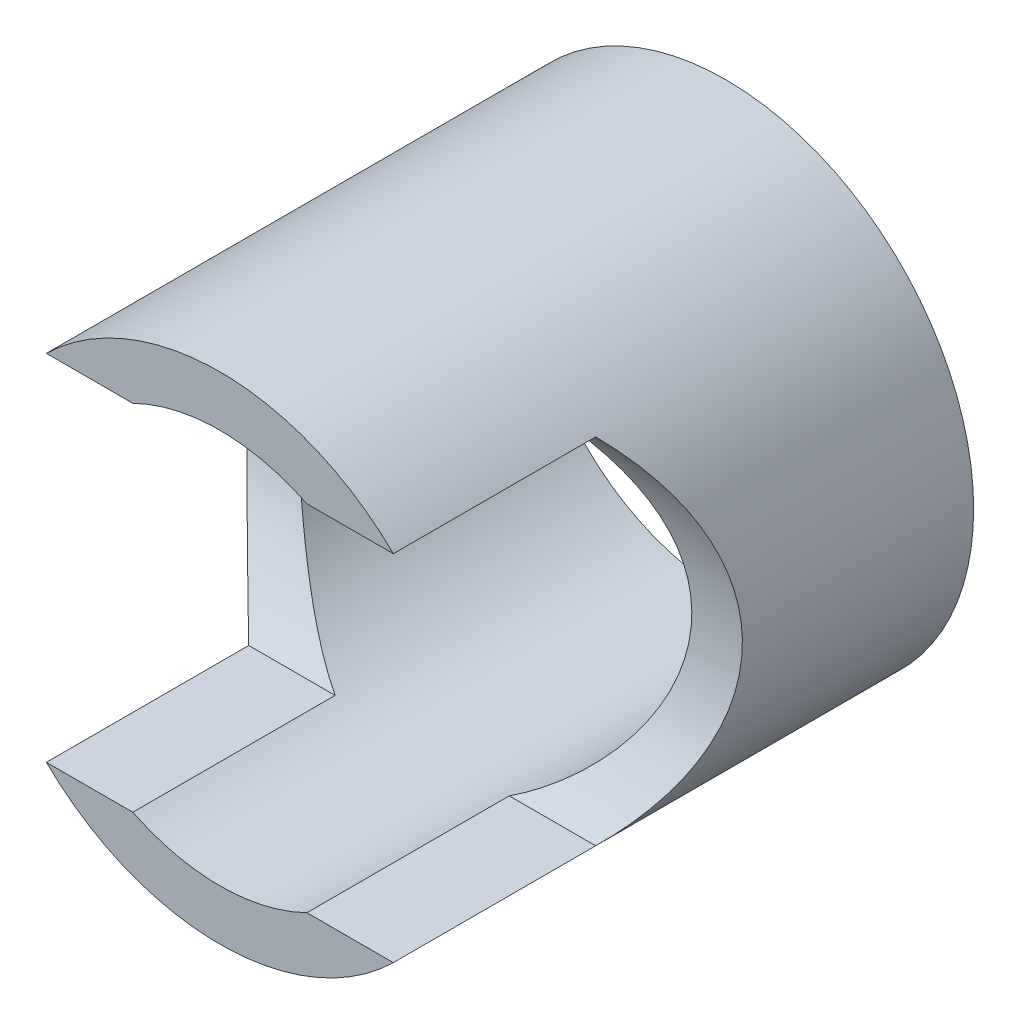
ISO-10303-21;
HEADER;
FILE_DESCRIPTION(('STEP AP214'),'2;1');
FILE_NAME('part.step','',(''),(''),'','','');
FILE_SCHEMA(('AUTOMOTIVE_DESIGN { 1 0 10303 214 1 1 1 1 }'));
ENDSEC;
DATA;
#1=APPLICATION_CONTEXT('core data for automotive mechanical design processes');
#2=APPLICATION_PROTOCOL_DEFINITION('international standard','automotive_design',2000,#1);
#3=PRODUCT_CONTEXT('',#1,'mechanical');
#4=PRODUCT('Part','Part','',(#3));
#5=PRODUCT_RELATED_PRODUCT_CATEGORY('part','',(#4));
#6=PRODUCT_DEFINITION_FORMATION('','',#4);
#7=PRODUCT_DEFINITION_CONTEXT('part definition',#1,'design');
#8=PRODUCT_DEFINITION('design','',#6,#7);
#9=PRODUCT_DEFINITION_SHAPE('','',#8);
#10=(LENGTH_UNIT() NAMED_UNIT(*) SI_UNIT(.MILLI.,.METRE.));
#11=(NAMED_UNIT(*) PLANE_ANGLE_UNIT() SI_UNIT($,.RADIAN.));
#12=(NAMED_UNIT(*) SI_UNIT($,.STERADIAN.) SOLID_ANGLE_UNIT());
#13=UNCERTAINTY_MEASURE_WITH_UNIT(LENGTH_MEASURE(1.E-05),#10,'distance_accuracy_value','');
#14=(GEOMETRIC_REPRESENTATION_CONTEXT(3) GLOBAL_UNCERTAINTY_ASSIGNED_CONTEXT((#13)) GLOBAL_UNIT_ASSIGNED_CONTEXT((#10,
#11,#12)) REPRESENTATION_CONTEXT('',''));
#15=CARTESIAN_POINT('',(0.,0.,0.));
#16=DIRECTION('',(0.,0.,1.));
#17=DIRECTION('',(1.,0.,0.));
#18=AXIS2_PLACEMENT_3D('',#15,#16,#17);
#19=CARTESIAN_POINT('',(0.,0.,10.));
#20=DIRECTION('',(0.,0.,1.));
#21=DIRECTION('',(1.,0.,0.));
#22=AXIS2_PLACEMENT_3D('',#19,#20,#21);
#23=PLANE('',#22);
#24=DIRECTION('',(1.,0.,0.));
#25=VECTOR('',#24,1.);
#26=CARTESIAN_POINT('',(-5.1,3.5,10.));
#27=LINE('',#26,#25);
#28=CARTESIAN_POINT('',(1.72046505340852,3.5,10.));
#29=VERTEX_POINT('',#28);
#30=CARTESIAN_POINT('',(3.42928563989645,3.5,10.));
#31=VERTEX_POINT('',#30);
#32=EDGE_CURVE('E124',#29,#31,#27,.T.);
#33=ORIENTED_EDGE('',*,*,#32,.T.);
#34=CARTESIAN_POINT('',(0.,0.,10.));
#35=DIRECTION('',(0.,0.,1.));
#36=DIRECTION('',(1.,0.,0.));
#37=AXIS2_PLACEMENT_3D('',#34,#35,#36);
#38=CIRCLE('',#37,4.9);
#39=CARTESIAN_POINT('',(-3.42928563989645,3.5,10.));
#40=VERTEX_POINT('',#39);
#41=EDGE_CURVE('E131',#31,#40,#38,.T.);
#42=ORIENTED_EDGE('',*,*,#41,.T.);
#43=CARTESIAN_POINT('',(-1.72046505340852,3.5,10.));
#44=VERTEX_POINT('',#43);
#45=EDGE_CURVE('E111',#40,#44,#27,.T.);
#46=ORIENTED_EDGE('',*,*,#45,.T.);
#47=CARTESIAN_POINT('',(0.,0.,10.));
#48=DIRECTION('',(0.,0.,1.));
#49=DIRECTION('',(1.,0.,0.));
#50=AXIS2_PLACEMENT_3D('',#47,#48,#49);
#51=CIRCLE('',#50,3.9);
#52=EDGE_CURVE('E155',#29,#44,#51,.T.);
#53=ORIENTED_EDGE('',*,*,#52,.F.);
#54=EDGE_LOOP('',(#33,#42,#46,#53));
#55=FACE_BOUND('',#54,.T.);
#56=ADVANCED_FACE('F45',(#55),#23,.T.);
#57=DIRECTION('',(1.,0.,0.));
#58=VECTOR('',#57,1.);
#59=CARTESIAN_POINT('',(-5.1,-3.5,10.));
#60=LINE('',#59,#58);
#61=CARTESIAN_POINT('',(-3.42928563989645,-3.5,10.));
#62=VERTEX_POINT('',#61);
#63=CARTESIAN_POINT('',(-1.72046505340852,-3.5,10.));
#64=VERTEX_POINT('',#63);
#65=EDGE_CURVE('E70',#62,#64,#60,.T.);
#66=ORIENTED_EDGE('',*,*,#65,.F.);
#67=CARTESIAN_POINT('',(3.42928563989645,-3.5,10.));
#68=VERTEX_POINT('',#67);
#69=EDGE_CURVE('E141',#62,#68,#38,.T.);
#70=ORIENTED_EDGE('',*,*,#69,.T.);
#71=CARTESIAN_POINT('',(1.72046505340852,-3.5,10.));
#72=VERTEX_POINT('',#71);
#73=EDGE_CURVE('E123',#72,#68,#60,.T.);
#74=ORIENTED_EDGE('',*,*,#73,.F.);
#75=EDGE_CURVE('E205',#64,#72,#51,.T.);
#76=ORIENTED_EDGE('',*,*,#75,.F.);
#77=EDGE_LOOP('',(#66,#70,#74,#76));
#78=FACE_BOUND('',#77,.T.);
#79=ADVANCED_FACE('F224',(#78),#23,.T.);
#80=CARTESIAN_POINT('',(0.,0.,0.));
#81=DIRECTION('',(0.,0.,1.));
#82=DIRECTION('',(1.,0.,0.));
#83=AXIS2_PLACEMENT_3D('',#80,#81,#82);
#84=PLANE('',#83);
#85=CARTESIAN_POINT('',(0.,0.,0.));
#86=DIRECTION('',(0.,0.,1.));
#87=DIRECTION('',(1.,0.,0.));
#88=AXIS2_PLACEMENT_3D('',#85,#86,#87);
#89=CIRCLE('',#88,4.9);
#90=CARTESIAN_POINT('',(4.9,0.,0.));
#91=VERTEX_POINT('',#90);
#92=EDGE_CURVE('E148',#91,#91,#89,.T.);
#93=ORIENTED_EDGE('',*,*,#92,.F.);
#94=EDGE_LOOP('',(#93));
#95=FACE_BOUND('',#94,.T.);
#96=CARTESIAN_POINT('',(0.,0.,0.));
#97=DIRECTION('',(0.,0.,1.));
#98=DIRECTION('',(1.,0.,0.));
#99=AXIS2_PLACEMENT_3D('',#96,#97,#98);
#100=CIRCLE('',#99,3.9);
#101=CARTESIAN_POINT('',(3.9,0.,0.));
#102=VERTEX_POINT('',#101);
#103=EDGE_CURVE('E151',#102,#102,#100,.T.);
#104=ORIENTED_EDGE('',*,*,#103,.T.);
#105=EDGE_LOOP('',(#104));
#106=FACE_BOUND('',#105,.T.);
#107=ADVANCED_FACE('F216',(#95,#106),#84,.F.);
#108=CARTESIAN_POINT('',(0.,0.,10.));
#109=DIRECTION('',(0.,0.,-1.));
#110=DIRECTION('',(-1.,0.,0.));
#111=AXIS2_PLACEMENT_3D('',#108,#109,#110);
#112=CYLINDRICAL_SURFACE('',#111,4.9);
#113=ORIENTED_EDGE('',*,*,#41,.F.);
#114=DIRECTION('',(0.,0.,-1.));
#115=VECTOR('',#114,1.);
#116=CARTESIAN_POINT('',(3.42928563989645,3.5,10.));
#117=LINE('',#116,#115);
#118=CARTESIAN_POINT('',(3.42928563989645,3.5,6.));
#119=VERTEX_POINT('',#118);
#120=EDGE_CURVE('E135',#31,#119,#117,.T.);
#121=ORIENTED_EDGE('',*,*,#120,.T.);
#122=CARTESIAN_POINT('',(3.42928563989645,3.5,6.));
#123=CARTESIAN_POINT('',(3.59647088448412,3.33615304909569,5.8393997068793));
#124=CARTESIAN_POINT('',(3.75570601331172,3.15668633621734,5.68561143874868));
#125=CARTESIAN_POINT('',(3.97859837261846,2.86288178823428,5.46963073103491));
#126=CARTESIAN_POINT('',(4.05055827961444,2.76026411110945,5.39977230884082));
#127=CARTESIAN_POINT('',(4.18793279886013,2.54702000985872,5.26623664662138));
#128=CARTESIAN_POINT('',(4.25335051737735,2.43639742992314,5.20255647356196));
#129=CARTESIAN_POINT('',(4.41347640695718,2.13875774468054,5.0465260072286));
#130=CARTESIAN_POINT('',(4.50240134290289,1.9455077445347,4.959711376047));
#131=CARTESIAN_POINT('',(4.61768038886163,1.64277148473097,4.84706013541428));
#132=CARTESIAN_POINT('',(4.65306059412761,1.53983232805395,4.81246570474566));
#133=CARTESIAN_POINT('',(4.71730046472611,1.33006900258503,4.74962734112169));
#134=CARTESIAN_POINT('',(4.74616322060221,1.22324670317915,4.72138039824865));
#135=CARTESIAN_POINT('',(4.79707588203657,1.00533773767093,4.67153980750522));
#136=CARTESIAN_POINT('',(4.81905831941332,0.894220157962149,4.65001205317787));
#137=CARTESIAN_POINT('',(4.8553641570014,0.669605201515297,4.61445073544212));
#138=CARTESIAN_POINT('',(4.86969129584225,0.556109014617853,4.60041351387552));
#139=CARTESIAN_POINT('',(4.8903793876584,0.327644498313018,4.58014247556506));
#140=CARTESIAN_POINT('',(4.89673671510595,0.21267552292952,4.57391221026551));
#141=CARTESIAN_POINT('',(4.90132097544629,-0.0175717222468311,4.56941967406483));
#142=CARTESIAN_POINT('',(4.89954883818889,-0.132849955159364,4.57115649188712));
#143=CARTESIAN_POINT('',(4.88866158728509,-0.34793253457521,4.58182544597551));
#144=CARTESIAN_POINT('',(4.8805121114451,-0.447834737506318,4.58981135704402));
#145=CARTESIAN_POINT('',(4.85821509354931,-0.646328156210551,4.61165693207009));
#146=CARTESIAN_POINT('',(4.84406570057012,-0.744918957739484,4.6255184085891));
#147=CARTESIAN_POINT('',(4.79297179723202,-1.03754229383496,4.67556052455862));
#148=CARTESIAN_POINT('',(4.74736529930223,-1.22872784316862,4.72021481873029));
#149=CARTESIAN_POINT('',(4.63463085723501,-1.60290962229225,4.83049665130938));
#150=CARTESIAN_POINT('',(4.5670571037257,-1.78563788896439,4.89655854449543));
#151=CARTESIAN_POINT('',(4.41396697748892,-2.13625025584745,5.04602247959144));
#152=CARTESIAN_POINT('',(4.32841099008432,-2.30410039931065,5.12946280225858));
#153=CARTESIAN_POINT('',(4.11993016437683,-2.66255110551661,5.33242474310469));
#154=CARTESIAN_POINT('',(3.99298904175377,-2.84860403448254,5.45577399385353));
#155=CARTESIAN_POINT('',(3.72243714970002,-3.19392868767649,5.71773122137827));
#156=CARTESIAN_POINT('',(3.57893243159212,-3.35335637376824,5.85624185859243));
#157=CARTESIAN_POINT('',(3.42928563989645,-3.5,6.));
#158=B_SPLINE_CURVE_WITH_KNOTS('',3,(#122,#123,#124,#125,#126,#127,#128,#129,#130,#131,#132,
#133,#134,#135,#136,#137,#138,#139,#140,#141,#142,#143,#144,#145,#146,#147,#148,#149,#150,#151,
#152,#153,#154,#155,#156,#157),.UNSPECIFIED.,.F.,.F.,(4,2,2,2,2,2,2,2,2,2,2,2,2,2,2,2,2,4),(0.,
0.851361120835262,1.28141106536544,1.71125584055542,2.39731391936444,2.73961448479553,
3.08175239045461,3.42714717030543,3.77237311466133,4.11775604800227,4.46309947735892,
4.76438503711408,5.06576360859585,5.66762331685644,6.2825516852289,6.89884920621709,
7.66661798584835,8.4297184229883),.UNSPECIFIED.);
#159=CARTESIAN_POINT('',(3.42928563989645,-3.5,6.));
#160=VERTEX_POINT('',#159);
#161=EDGE_CURVE('E136',#119,#160,#158,.T.);
#162=ORIENTED_EDGE('',*,*,#161,.T.);
#163=DIRECTION('',(0.,0.,-1.));
#164=VECTOR('',#163,1.);
#165=CARTESIAN_POINT('',(3.42928563989645,-3.5,10.));
#166=LINE('',#165,#164);
#167=EDGE_CURVE('E322',#160,#68,#166,.F.);
#168=ORIENTED_EDGE('',*,*,#167,.T.);
#169=ORIENTED_EDGE('',*,*,#69,.F.);
#170=DIRECTION('',(0.,0.,-1.));
#171=VECTOR('',#170,1.);
#172=CARTESIAN_POINT('',(-3.42928563989645,-3.5,10.));
#173=LINE('',#172,#171);
#174=CARTESIAN_POINT('',(-3.42928563989645,-3.5,6.));
#175=VERTEX_POINT('',#174);
#176=EDGE_CURVE('E195',#62,#175,#173,.T.);
#177=ORIENTED_EDGE('',*,*,#176,.T.);
#178=CARTESIAN_POINT('',(-3.42928563989645,-3.5,6.));
#179=CARTESIAN_POINT('',(-3.59647088448412,-3.33615304909569,5.8393997068793));
#180=CARTESIAN_POINT('',(-3.75570601331172,-3.15668633621734,5.68561143874868));
#181=CARTESIAN_POINT('',(-3.97859837261846,-2.86288178823428,5.46963073103491));
#182=CARTESIAN_POINT('',(-4.05055827961444,-2.76026411110945,5.39977230884082));
#183=CARTESIAN_POINT('',(-4.18793279886013,-2.54702000985872,5.26623664662138));
#184=CARTESIAN_POINT('',(-4.25335051737735,-2.43639742992314,5.20255647356196));
#185=CARTESIAN_POINT('',(-4.41347640695718,-2.13875774468054,5.0465260072286));
#186=CARTESIAN_POINT('',(-4.50240134290289,-1.9455077445347,4.959711376047));
#187=CARTESIAN_POINT('',(-4.61768038886163,-1.64277148473097,4.84706013541428));
#188=CARTESIAN_POINT('',(-4.65306059412761,-1.53983232805395,4.81246570474566));
#189=CARTESIAN_POINT('',(-4.71730046472611,-1.33006900258503,4.74962734112169));
#190=CARTESIAN_POINT('',(-4.74616322060221,-1.22324670317915,4.72138039824865));
#191=CARTESIAN_POINT('',(-4.79707588203657,-1.00533773767093,4.67153980750522));
#192=CARTESIAN_POINT('',(-4.81905831941332,-0.894220157962148,4.65001205317787));
#193=CARTESIAN_POINT('',(-4.8553641570014,-0.669605201515295,4.61445073544212));
#194=CARTESIAN_POINT('',(-4.86969129584225,-0.556109014617852,4.60041351387552));
#195=CARTESIAN_POINT('',(-4.8903793876584,-0.327644498313016,4.58014247556506));
#196=CARTESIAN_POINT('',(-4.89673671510595,-0.212675522929518,4.57391221026551));
#197=CARTESIAN_POINT('',(-4.90132097544629,0.0175717222468332,4.56941967406483));
#198=CARTESIAN_POINT('',(-4.89954883818889,0.132849955159367,4.57115649188712));
#199=CARTESIAN_POINT('',(-4.88866158728509,0.347932534575213,4.58182544597551));
#200=CARTESIAN_POINT('',(-4.8805121114451,0.447834737506321,4.58981135704402));
#201=CARTESIAN_POINT('',(-4.85821509354931,0.646328156210554,4.61165693207009));
#202=CARTESIAN_POINT('',(-4.84406570057012,0.744918957739487,4.6255184085891));
#203=CARTESIAN_POINT('',(-4.79297179723202,1.03754229383497,4.67556052455862));
#204=CARTESIAN_POINT('',(-4.74736529930223,1.22872784316863,4.72021481873029));
#205=CARTESIAN_POINT('',(-4.63463085723501,1.60290962229225,4.83049665130938));
#206=CARTESIAN_POINT('',(-4.5670571037257,1.78563788896439,4.89655854449543));
#207=CARTESIAN_POINT('',(-4.41396697748892,2.13625025584745,5.04602247959144));
#208=CARTESIAN_POINT('',(-4.32841099008432,2.30410039931065,5.12946280225858));
#209=CARTESIAN_POINT('',(-4.11993016437683,2.66255110551661,5.33242474310469));
#210=CARTESIAN_POINT('',(-3.99298904175377,2.84860403448255,5.45577399385353));
#211=CARTESIAN_POINT('',(-3.72243714970002,3.19392868767649,5.71773122137827));
#212=CARTESIAN_POINT('',(-3.57893243159212,3.35335637376824,5.85624185859243));
#213=CARTESIAN_POINT('',(-3.42928563989645,3.5,6.));
#214=B_SPLINE_CURVE_WITH_KNOTS('',3,(#178,#179,#180,#181,#182,#183,#184,#185,#186,#187,#188,
#189,#190,#191,#192,#193,#194,#195,#196,#197,#198,#199,#200,#201,#202,#203,#204,#205,#206,#207,
#208,#209,#210,#211,#212,#213),.UNSPECIFIED.,.F.,.F.,(4,2,2,2,2,2,2,2,2,2,2,2,2,2,2,2,2,4),(0.,
0.851361120835261,1.28141106536544,1.71125584055542,2.39731391936443,2.73961448479553,
3.08175239045461,3.42714717030543,3.77237311466134,4.11775604800227,4.46309947735892,
4.76438503711408,5.06576360859585,5.66762331685644,6.28255168522891,6.89884920621709,
7.66661798584835,8.4297184229883),.UNSPECIFIED.);
#215=CARTESIAN_POINT('',(-3.42928563989645,3.5,6.));
#216=VERTEX_POINT('',#215);
#217=EDGE_CURVE('E133',#175,#216,#214,.T.);
#218=ORIENTED_EDGE('',*,*,#217,.T.);
#219=DIRECTION('',(0.,0.,-1.));
#220=VECTOR('',#219,1.);
#221=CARTESIAN_POINT('',(-3.42928563989645,3.5,10.));
#222=LINE('',#221,#220);
#223=EDGE_CURVE('E115',#216,#40,#222,.F.);
#224=ORIENTED_EDGE('',*,*,#223,.T.);
#225=EDGE_LOOP('',(#113,#121,#162,#168,#169,#177,#218,#224));
#226=FACE_BOUND('',#225,.T.);
#227=ORIENTED_EDGE('',*,*,#92,.T.);
#228=EDGE_LOOP('',(#227));
#229=FACE_BOUND('',#228,.T.);
#230=ADVANCED_FACE('F47',(#226,#229),#112,.T.);
#231=CARTESIAN_POINT('',(0.,0.,10.));
#232=DIRECTION('',(0.,0.,-1.));
#233=DIRECTION('',(-1.,0.,0.));
#234=AXIS2_PLACEMENT_3D('',#231,#232,#233);
#235=CYLINDRICAL_SURFACE('',#234,3.9);
#236=DIRECTION('',(0.,0.,-1.));
#237=VECTOR('',#236,1.);
#238=CARTESIAN_POINT('',(-1.72046505340852,3.5,10.));
#239=LINE('',#238,#237);
#240=CARTESIAN_POINT('',(-1.72046505340852,3.5,6.));
#241=VERTEX_POINT('',#240);
#242=EDGE_CURVE('E11',#241,#44,#239,.F.);
#243=ORIENTED_EDGE('',*,*,#242,.F.);
#244=CARTESIAN_POINT('',(-1.72046505340852,-3.5,6.));
#245=CARTESIAN_POINT('',(-1.82779019322518,-3.44720081307893,5.94821291357888));
#246=CARTESIAN_POINT('',(-1.93188173605775,-3.3899433856009,5.89441702569065));
#247=CARTESIAN_POINT('',(-2.13356582335354,-3.26679276123773,5.78458124351546));
#248=CARTESIAN_POINT('',(-2.23115891055668,-3.2009002869047,5.72854153725595));
#249=CARTESIAN_POINT('',(-2.42083231343526,-3.06000849046121,5.61538583618446));
#250=CARTESIAN_POINT('',(-2.51284321972977,-2.98492003085673,5.55826472945975));
#251=CARTESIAN_POINT('',(-2.68998587949694,-2.82632504857971,5.44501706391567));
#252=CARTESIAN_POINT('',(-2.77511732826286,-2.74281815340339,5.3888905492349));
#253=CARTESIAN_POINT('',(-2.93822049550034,-2.56733918339953,5.27891828083074));
#254=CARTESIAN_POINT('',(-3.01617898753012,-2.47535207282003,5.22507683531273));
#255=CARTESIAN_POINT('',(-3.1641321562885,-2.28319331057521,5.12111164003395));
#256=CARTESIAN_POINT('',(-3.23412630133564,-2.18302111325843,5.07098813855221));
#257=CARTESIAN_POINT('',(-3.36501467501043,-1.97526444639742,4.97601003996784));
#258=CARTESIAN_POINT('',(-3.42594958293889,-1.8677164895813,4.93113209552904));
#259=CARTESIAN_POINT('',(-3.53809703219129,-1.64540957349172,4.84771414357021));
#260=CARTESIAN_POINT('',(-3.58931442874262,-1.53065425363457,4.80917097225803));
#261=CARTESIAN_POINT('',(-3.69872281218233,-1.24906927094964,4.72625177707498));
#262=CARTESIAN_POINT('',(-3.75198594509472,-1.07922407683781,4.68535858282045));
#263=CARTESIAN_POINT('',(-3.83512150816439,-0.730693188799382,4.62122365854441));
#264=CARTESIAN_POINT('',(-3.86500250858518,-0.552010759544098,4.59797546118829));
#265=CARTESIAN_POINT('',(-3.89960871945331,-0.190156755574682,4.57103162156407));
#266=CARTESIAN_POINT('',(-3.90425706612272,-0.00697316985990659,4.56739572254398));
#267=CARTESIAN_POINT('',(-3.88786160933613,0.357524948666466,4.58017892216107));
#268=CARTESIAN_POINT('',(-3.86681576088007,0.538839331549972,4.59659961710189));
#269=CARTESIAN_POINT('',(-3.80197117586339,0.885861771143153,4.64683449798546));
#270=CARTESIAN_POINT('',(-3.75927361029908,1.05190359254279,4.67980617627754));
#271=CARTESIAN_POINT('',(-3.65397298086094,1.37374580223862,4.76027054118607));
#272=CARTESIAN_POINT('',(-3.59136747681555,1.52954493223305,4.80776500787378));
#273=CARTESIAN_POINT('',(-3.44167657958895,1.84337109909312,4.91964808013358));
#274=CARTESIAN_POINT('',(-3.35278389297648,2.00009790029232,4.98524208837012));
#275=CARTESIAN_POINT('',(-3.15687578778482,2.29691629154981,5.12647598177189));
#276=CARTESIAN_POINT('',(-3.04983810288807,2.43698707875346,5.20212818477034));
#277=CARTESIAN_POINT('',(-2.7965694758015,2.72642252948765,5.3754128717374));
#278=CARTESIAN_POINT('',(-2.64679574332748,2.87187386003092,5.47438467780455));
#279=CARTESIAN_POINT('',(-2.32679369820063,3.13673730359606,5.67350935114836));
#280=CARTESIAN_POINT('',(-2.15659664926713,3.25618844803311,5.77366020682221));
#281=CARTESIAN_POINT('',(-1.93491157874474,3.38650820902509,5.89203641586831));
#282=CARTESIAN_POINT('',(-1.89275654497333,3.41025257125084,5.91405111549223));
#283=CARTESIAN_POINT('',(-1.80740644229617,3.45624536223335,5.957493808899));
#284=CARTESIAN_POINT('',(-1.76421242211502,3.47849521999768,5.97892235118288));
#285=CARTESIAN_POINT('',(-1.72046505340852,3.5,6.));
#286=B_SPLINE_CURVE_WITH_KNOTS('',3,(#244,#245,#246,#247,#248,#249,#250,#251,#252,#253,#254,
#255,#256,#257,#258,#259,#260,#261,#262,#263,#264,#265,#266,#267,#268,#269,#270,#271,#272,#273,
#274,#275,#276,#277,#278,#279,#280,#281,#282,#283,#284,#285),.UNSPECIFIED.,.F.,.F.,(4,2,2,2,2,2,
2,2,2,2,2,2,2,2,2,2,2,2,2,2,4),(0.,0.390804058848245,0.781575437362796,1.1764894276682,
1.57142090003113,1.96706658652467,2.36273866993574,2.75657658437902,3.15021720166252,
3.69566368382083,4.24091014946862,4.78781661817378,5.3347666179827,5.85633534575382,
6.37796802831749,6.95112941609271,7.52499930887871,8.2156997053583,8.90535596139311,
9.06479996945604,9.22408928458897),.UNSPECIFIED.);
#287=CARTESIAN_POINT('',(-1.72046505340852,-3.5,6.));
#288=VERTEX_POINT('',#287);
#289=EDGE_CURVE('E55',#288,#241,#286,.T.);
#290=ORIENTED_EDGE('',*,*,#289,.F.);
#291=DIRECTION('',(0.,0.,-1.));
#292=VECTOR('',#291,1.);
#293=CARTESIAN_POINT('',(-1.72046505340852,-3.5,10.));
#294=LINE('',#293,#292);
#295=EDGE_CURVE('E305',#64,#288,#294,.T.);
#296=ORIENTED_EDGE('',*,*,#295,.F.);
#297=ORIENTED_EDGE('',*,*,#75,.T.);
#298=DIRECTION('',(0.,0.,-1.));
#299=VECTOR('',#298,1.);
#300=CARTESIAN_POINT('',(1.72046505340852,-3.5,10.));
#301=LINE('',#300,#299);
#302=CARTESIAN_POINT('',(1.72046505340852,-3.5,6.));
#303=VERTEX_POINT('',#302);
#304=EDGE_CURVE('E140',#303,#72,#301,.F.);
#305=ORIENTED_EDGE('',*,*,#304,.F.);
#306=CARTESIAN_POINT('',(1.72046505340852,3.5,6.));
#307=CARTESIAN_POINT('',(1.82779019322518,3.44720081307893,5.94821291357888));
#308=CARTESIAN_POINT('',(1.93188173605775,3.3899433856009,5.89441702569065));
#309=CARTESIAN_POINT('',(2.13356582335353,3.26679276123773,5.78458124351546));
#310=CARTESIAN_POINT('',(2.23115891055668,3.2009002869047,5.72854153725595));
#311=CARTESIAN_POINT('',(2.42083231343526,3.06000849046121,5.61538583618446));
#312=CARTESIAN_POINT('',(2.51284321972977,2.98492003085673,5.55826472945975));
#313=CARTESIAN_POINT('',(2.68998587949694,2.82632504857971,5.44501706391567));
#314=CARTESIAN_POINT('',(2.77511732826286,2.7428181534034,5.3888905492349));
#315=CARTESIAN_POINT('',(2.93822049550034,2.56733918339953,5.27891828083074));
#316=CARTESIAN_POINT('',(3.01617898753012,2.47535207282003,5.22507683531273));
#317=CARTESIAN_POINT('',(3.1641321562885,2.28319331057521,5.12111164003394));
#318=CARTESIAN_POINT('',(3.23412630133564,2.18302111325843,5.07098813855221));
#319=CARTESIAN_POINT('',(3.36501467501043,1.97526444639742,4.97601003996784));
#320=CARTESIAN_POINT('',(3.42594958293889,1.86771648958131,4.93113209552904));
#321=CARTESIAN_POINT('',(3.53809703219129,1.64540957349172,4.84771414357021));
#322=CARTESIAN_POINT('',(3.58931442874262,1.53065425363457,4.80917097225803));
#323=CARTESIAN_POINT('',(3.69872281218233,1.24906927094964,4.72625177707498));
#324=CARTESIAN_POINT('',(3.75198594509472,1.07922407683781,4.68535858282045));
#325=CARTESIAN_POINT('',(3.83512150816439,0.730693188799382,4.62122365854441));
#326=CARTESIAN_POINT('',(3.86500250858518,0.552010759544099,4.59797546118829));
#327=CARTESIAN_POINT('',(3.89960871945331,0.190156755574683,4.57103162156407));
#328=CARTESIAN_POINT('',(3.90425706612272,0.00697316985990703,4.56739572254398));
#329=CARTESIAN_POINT('',(3.88786160933613,-0.357524948666465,4.58017892216107));
#330=CARTESIAN_POINT('',(3.86681576088007,-0.538839331549972,4.59659961710189));
#331=CARTESIAN_POINT('',(3.80197117586339,-0.885861771143153,4.64683449798546));
#332=CARTESIAN_POINT('',(3.75927361029908,-1.05190359254279,4.67980617627754));
#333=CARTESIAN_POINT('',(3.65397298086094,-1.37374580223862,4.76027054118607));
#334=CARTESIAN_POINT('',(3.59136747681555,-1.52954493223305,4.80776500787378));
#335=CARTESIAN_POINT('',(3.44167657958895,-1.84337109909312,4.91964808013359));
#336=CARTESIAN_POINT('',(3.35278389297647,-2.00009790029232,4.98524208837013));
#337=CARTESIAN_POINT('',(3.15687578778482,-2.29691629154981,5.12647598177189));
#338=CARTESIAN_POINT('',(3.04983810288807,-2.43698707875346,5.20212818477034));
#339=CARTESIAN_POINT('',(2.79656947580151,-2.72642252948765,5.3754128717374));
#340=CARTESIAN_POINT('',(2.64679574332748,-2.87187386003092,5.47438467780455));
#341=CARTESIAN_POINT('',(2.32679369820063,-3.13673730359606,5.67350935114836));
#342=CARTESIAN_POINT('',(2.15659664926713,-3.25618844803311,5.77366020682222));
#343=CARTESIAN_POINT('',(1.93491157874474,-3.38650820902509,5.89203641586831));
#344=CARTESIAN_POINT('',(1.89275654497333,-3.41025257125084,5.91405111549223));
#345=CARTESIAN_POINT('',(1.80740644229617,-3.45624536223335,5.957493808899));
#346=CARTESIAN_POINT('',(1.76421242211502,-3.47849521999768,5.97892235118288));
#347=CARTESIAN_POINT('',(1.72046505340852,-3.5,6.));
#348=B_SPLINE_CURVE_WITH_KNOTS('',3,(#306,#307,#308,#309,#310,#311,#312,#313,#314,#315,#316,
#317,#318,#319,#320,#321,#322,#323,#324,#325,#326,#327,#328,#329,#330,#331,#332,#333,#334,#335,
#336,#337,#338,#339,#340,#341,#342,#343,#344,#345,#346,#347),.UNSPECIFIED.,.F.,.F.,(4,2,2,2,2,2,
2,2,2,2,2,2,2,2,2,2,2,2,2,2,4),(0.,0.390804058848245,0.781575437362796,1.1764894276682,
1.57142090003113,1.96706658652467,2.36273866993574,2.75657658437902,3.15021720166252,
3.69566368382083,4.24091014946862,4.78781661817378,5.3347666179827,5.85633534575382,
6.37796802831749,6.95112941609271,7.52499930887871,8.2156997053583,8.90535596139311,
9.06479996945605,9.22408928458897),.UNSPECIFIED.);
#349=CARTESIAN_POINT('',(1.72046505340852,3.5,6.));
#350=VERTEX_POINT('',#349);
#351=EDGE_CURVE('E145',#350,#303,#348,.T.);
#352=ORIENTED_EDGE('',*,*,#351,.F.);
#353=DIRECTION('',(0.,0.,-1.));
#354=VECTOR('',#353,1.);
#355=CARTESIAN_POINT('',(1.72046505340852,3.5,10.));
#356=LINE('',#355,#354);
#357=EDGE_CURVE('E165',#29,#350,#356,.T.);
#358=ORIENTED_EDGE('',*,*,#357,.F.);
#359=ORIENTED_EDGE('',*,*,#52,.T.);
#360=EDGE_LOOP('',(#243,#290,#296,#297,#305,#352,#358,#359));
#361=FACE_BOUND('',#360,.T.);
#362=ORIENTED_EDGE('',*,*,#103,.F.);
#363=EDGE_LOOP('',(#362));
#364=FACE_BOUND('',#363,.T.);
#365=ADVANCED_FACE('F167',(#361,#364),#235,.F.);
#366=CARTESIAN_POINT('',(-5.1,-3.5,10.));
#367=DIRECTION('',(0.,-1.,0.));
#368=DIRECTION('',(0.,0.,-1.));
#369=AXIS2_PLACEMENT_3D('',#366,#367,#368);
#370=PLANE('',#369);
#371=DIRECTION('',(1.,0.,0.));
#372=VECTOR('',#371,1.);
#373=CARTESIAN_POINT('',(-5.1,-3.5,6.));
#374=LINE('',#373,#372);
#375=EDGE_CURVE('E62',#303,#160,#374,.T.);
#376=ORIENTED_EDGE('',*,*,#375,.F.);
#377=ORIENTED_EDGE('',*,*,#304,.T.);
#378=ORIENTED_EDGE('',*,*,#73,.T.);
#379=ORIENTED_EDGE('',*,*,#167,.F.);
#380=EDGE_LOOP('',(#376,#377,#378,#379));
#381=FACE_BOUND('',#380,.T.);
#382=ADVANCED_FACE('F176',(#381),#370,.F.);
#383=CARTESIAN_POINT('',(-5.1,0.,9.57071421427142));
#384=DIRECTION('',(1.,0.,0.));
#385=DIRECTION('',(0.,0.,-1.));
#386=AXIS2_PLACEMENT_3D('',#383,#384,#385);
#387=CYLINDRICAL_SURFACE('',#386,5.);
#388=DIRECTION('',(1.,0.,0.));
#389=VECTOR('',#388,1.);
#390=CARTESIAN_POINT('',(-5.1,3.5,6.));
#391=LINE('',#390,#389);
#392=EDGE_CURVE('E303',#350,#119,#391,.T.);
#393=ORIENTED_EDGE('',*,*,#392,.F.);
#394=ORIENTED_EDGE('',*,*,#351,.T.);
#395=ORIENTED_EDGE('',*,*,#375,.T.);
#396=ORIENTED_EDGE('',*,*,#161,.F.);
#397=EDGE_LOOP('',(#393,#394,#395,#396));
#398=FACE_BOUND('',#397,.T.);
#399=ADVANCED_FACE('F171',(#398),#387,.F.);
#400=CARTESIAN_POINT('',(-5.1,3.5,10.));
#401=DIRECTION('',(0.,1.,0.));
#402=DIRECTION('',(0.,0.,1.));
#403=AXIS2_PLACEMENT_3D('',#400,#401,#402);
#404=PLANE('',#403);
#405=ORIENTED_EDGE('',*,*,#32,.F.);
#406=ORIENTED_EDGE('',*,*,#357,.T.);
#407=ORIENTED_EDGE('',*,*,#392,.T.);
#408=ORIENTED_EDGE('',*,*,#120,.F.);
#409=EDGE_LOOP('',(#405,#406,#407,#408));
#410=FACE_BOUND('',#409,.T.);
#411=ADVANCED_FACE('F175',(#410),#404,.F.);
#412=EDGE_CURVE('E313',#216,#241,#391,.T.);
#413=ORIENTED_EDGE('',*,*,#412,.T.);
#414=ORIENTED_EDGE('',*,*,#242,.T.);
#415=ORIENTED_EDGE('',*,*,#45,.F.);
#416=ORIENTED_EDGE('',*,*,#223,.F.);
#417=EDGE_LOOP('',(#413,#414,#415,#416));
#418=FACE_BOUND('',#417,.T.);
#419=ADVANCED_FACE('F114',(#418),#404,.F.);
#420=EDGE_CURVE('E300',#175,#288,#374,.T.);
#421=ORIENTED_EDGE('',*,*,#420,.T.);
#422=ORIENTED_EDGE('',*,*,#289,.T.);
#423=ORIENTED_EDGE('',*,*,#412,.F.);
#424=ORIENTED_EDGE('',*,*,#217,.F.);
#425=EDGE_LOOP('',(#421,#422,#423,#424));
#426=FACE_BOUND('',#425,.T.);
#427=ADVANCED_FACE('F178',(#426),#387,.F.);
#428=ORIENTED_EDGE('',*,*,#65,.T.);
#429=ORIENTED_EDGE('',*,*,#295,.T.);
#430=ORIENTED_EDGE('',*,*,#420,.F.);
#431=ORIENTED_EDGE('',*,*,#176,.F.);
#432=EDGE_LOOP('',(#428,#429,#430,#431));
#433=FACE_BOUND('',#432,.T.);
#434=ADVANCED_FACE('F179',(#433),#370,.F.);
#435=CLOSED_SHELL('',(#56,#79,#107,#230,#365,#382,#399,#411,#419,#427,#434));
#436=MANIFOLD_SOLID_BREP('B2',#435);
#437=ADVANCED_BREP_SHAPE_REPRESENTATION('',(#18,#436),#14);
#438=SHAPE_DEFINITION_REPRESENTATION(#9,#437);
ENDSEC;
END-ISO-10303-21;
